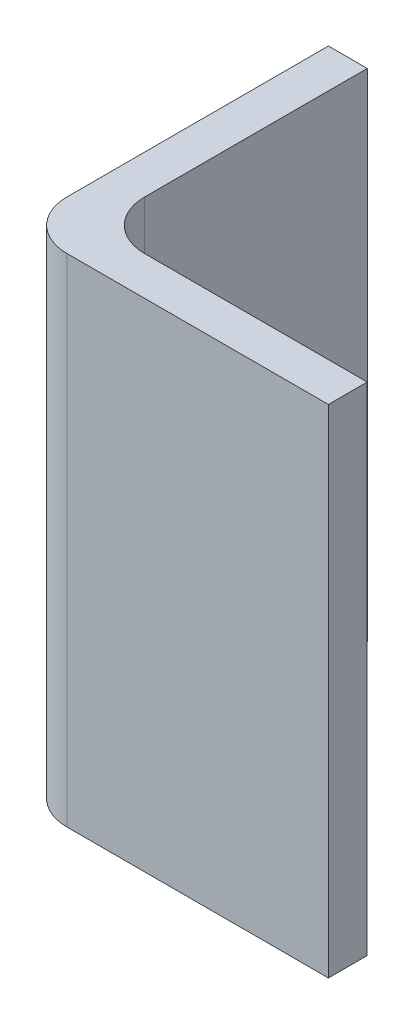
ISO-10303-21;
HEADER;
FILE_DESCRIPTION(('STEP AP214'),'2;1');
FILE_NAME('part.step','',(''),(''),'','','');
FILE_SCHEMA(('AUTOMOTIVE_DESIGN { 1 0 10303 214 1 1 1 1 }'));
ENDSEC;
DATA;
#1=APPLICATION_CONTEXT('core data for automotive mechanical design processes');
#2=APPLICATION_PROTOCOL_DEFINITION('international standard','automotive_design',2000,#1);
#3=PRODUCT_CONTEXT('',#1,'mechanical');
#4=PRODUCT('Part','Part','',(#3));
#5=PRODUCT_RELATED_PRODUCT_CATEGORY('part','',(#4));
#6=PRODUCT_DEFINITION_FORMATION('','',#4);
#7=PRODUCT_DEFINITION_CONTEXT('part definition',#1,'design');
#8=PRODUCT_DEFINITION('design','',#6,#7);
#9=PRODUCT_DEFINITION_SHAPE('','',#8);
#10=(LENGTH_UNIT() NAMED_UNIT(*) SI_UNIT(.MILLI.,.METRE.));
#11=(NAMED_UNIT(*) PLANE_ANGLE_UNIT() SI_UNIT($,.RADIAN.));
#12=(NAMED_UNIT(*) SI_UNIT($,.STERADIAN.) SOLID_ANGLE_UNIT());
#13=UNCERTAINTY_MEASURE_WITH_UNIT(LENGTH_MEASURE(1.E-05),#10,'distance_accuracy_value','');
#14=(GEOMETRIC_REPRESENTATION_CONTEXT(3) GLOBAL_UNCERTAINTY_ASSIGNED_CONTEXT((#13)) GLOBAL_UNIT_ASSIGNED_CONTEXT((#10,
#11,#12)) REPRESENTATION_CONTEXT('',''));
#15=CARTESIAN_POINT('',(0.,0.,0.));
#16=DIRECTION('',(0.,0.,1.));
#17=DIRECTION('',(1.,0.,0.));
#18=AXIS2_PLACEMENT_3D('',#15,#16,#17);
#19=CARTESIAN_POINT('',(-7.9433301054421,20.32,-9.79778819955743));
#20=DIRECTION('',(1.,0.,0.));
#21=DIRECTION('',(0.,0.,-1.));
#22=AXIS2_PLACEMENT_3D('',#19,#20,#21);
#23=PLANE('',#22);
#24=DIRECTION('',(0.,0.,1.));
#25=VECTOR('',#24,1.);
#26=CARTESIAN_POINT('',(-7.9433301054421,0.,-9.79778819955743));
#27=LINE('',#26,#25);
#28=CARTESIAN_POINT('',(-7.9433301054421,0.,-9.79778819955743));
#29=VERTEX_POINT('',#28);
#30=CARTESIAN_POINT('',(-7.9433301054421,0.,0.902211800442573));
#31=VERTEX_POINT('',#30);
#32=EDGE_CURVE('E132',#29,#31,#27,.T.);
#33=ORIENTED_EDGE('',*,*,#32,.T.);
#34=DIRECTION('',(0.,-1.,0.));
#35=VECTOR('',#34,1.);
#36=CARTESIAN_POINT('',(-7.9433301054421,20.32,0.902211800442573));
#37=LINE('',#36,#35);
#38=CARTESIAN_POINT('',(-7.9433301054421,20.32,0.902211800442573));
#39=VERTEX_POINT('',#38);
#40=EDGE_CURVE('E41',#31,#39,#37,.F.);
#41=ORIENTED_EDGE('',*,*,#40,.T.);
#42=DIRECTION('',(0.,0.,1.));
#43=VECTOR('',#42,1.);
#44=CARTESIAN_POINT('',(-7.9433301054421,20.32,-9.79778819955743));
#45=LINE('',#44,#43);
#46=CARTESIAN_POINT('',(-7.9433301054421,20.32,-9.79778819955743));
#47=VERTEX_POINT('',#46);
#48=EDGE_CURVE('E108',#47,#39,#45,.T.);
#49=ORIENTED_EDGE('',*,*,#48,.F.);
#50=DIRECTION('',(0.,-1.,0.));
#51=VECTOR('',#50,1.);
#52=CARTESIAN_POINT('',(-7.9433301054421,20.32,-9.79778819955743));
#53=LINE('',#52,#51);
#54=EDGE_CURVE('E131',#47,#29,#53,.T.);
#55=ORIENTED_EDGE('',*,*,#54,.T.);
#56=EDGE_LOOP('',(#33,#41,#49,#55));
#57=FACE_BOUND('',#56,.T.);
#58=ADVANCED_FACE('F33',(#57),#23,.F.);
#59=CARTESIAN_POINT('',(-6.3533301054421,20.32,2.90221180044257));
#60=DIRECTION('',(0.,0.,-1.));
#61=DIRECTION('',(-1.,0.,0.));
#62=AXIS2_PLACEMENT_3D('',#59,#60,#61);
#63=PLANE('',#62);
#64=DIRECTION('',(1.,0.,0.));
#65=VECTOR('',#64,1.);
#66=CARTESIAN_POINT('',(-7.9433301054421,20.32,2.90221180044257));
#67=LINE('',#66,#65);
#68=CARTESIAN_POINT('',(-5.9433301054421,20.32,2.90221180044257));
#69=VERTEX_POINT('',#68);
#70=CARTESIAN_POINT('',(4.7566698945579,20.32,2.90221180044257));
#71=VERTEX_POINT('',#70);
#72=EDGE_CURVE('E97',#69,#71,#67,.T.);
#73=ORIENTED_EDGE('',*,*,#72,.F.);
#74=DIRECTION('',(0.,-1.,0.));
#75=VECTOR('',#74,1.);
#76=CARTESIAN_POINT('',(-5.9433301054421,20.32,2.90221180044257));
#77=LINE('',#76,#75);
#78=CARTESIAN_POINT('',(-5.9433301054421,0.,2.90221180044257));
#79=VERTEX_POINT('',#78);
#80=EDGE_CURVE('E158',#69,#79,#77,.T.);
#81=ORIENTED_EDGE('',*,*,#80,.T.);
#82=DIRECTION('',(1.,0.,0.));
#83=VECTOR('',#82,1.);
#84=CARTESIAN_POINT('',(-6.3533301054421,0.,2.90221180044257));
#85=LINE('',#84,#83);
#86=CARTESIAN_POINT('',(4.7566698945579,0.,2.90221180044257));
#87=VERTEX_POINT('',#86);
#88=EDGE_CURVE('E113',#79,#87,#85,.T.);
#89=ORIENTED_EDGE('',*,*,#88,.T.);
#90=DIRECTION('',(0.,-1.,0.));
#91=VECTOR('',#90,1.);
#92=CARTESIAN_POINT('',(4.7566698945579,20.32,2.90221180044257));
#93=LINE('',#92,#91);
#94=EDGE_CURVE('E111',#71,#87,#93,.T.);
#95=ORIENTED_EDGE('',*,*,#94,.F.);
#96=EDGE_LOOP('',(#73,#81,#89,#95));
#97=FACE_BOUND('',#96,.T.);
#98=ADVANCED_FACE('F112',(#97),#63,.F.);
#99=CARTESIAN_POINT('',(4.7566698945579,20.32,2.90221180044257));
#100=DIRECTION('',(-1.,0.,0.));
#101=DIRECTION('',(0.,0.,1.));
#102=AXIS2_PLACEMENT_3D('',#99,#100,#101);
#103=PLANE('',#102);
#104=DIRECTION('',(0.,0.,-1.));
#105=VECTOR('',#104,1.);
#106=CARTESIAN_POINT('',(4.7566698945579,0.,2.90221180044257));
#107=LINE('',#106,#105);
#108=CARTESIAN_POINT('',(4.7566698945579,0.,1.31471180044257));
#109=VERTEX_POINT('',#108);
#110=EDGE_CURVE('E135',#87,#109,#107,.T.);
#111=ORIENTED_EDGE('',*,*,#110,.T.);
#112=DIRECTION('',(0.,-1.,0.));
#113=VECTOR('',#112,1.);
#114=CARTESIAN_POINT('',(4.7566698945579,20.32,1.31471180044257));
#115=LINE('',#114,#113);
#116=CARTESIAN_POINT('',(4.7566698945579,20.32,1.31471180044257));
#117=VERTEX_POINT('',#116);
#118=EDGE_CURVE('E117',#117,#109,#115,.T.);
#119=ORIENTED_EDGE('',*,*,#118,.F.);
#120=DIRECTION('',(0.,0.,-1.));
#121=VECTOR('',#120,1.);
#122=CARTESIAN_POINT('',(4.7566698945579,20.32,2.90221180044257));
#123=LINE('',#122,#121);
#124=EDGE_CURVE('E102',#71,#117,#123,.T.);
#125=ORIENTED_EDGE('',*,*,#124,.F.);
#126=ORIENTED_EDGE('',*,*,#94,.T.);
#127=EDGE_LOOP('',(#111,#119,#125,#126));
#128=FACE_BOUND('',#127,.T.);
#129=ADVANCED_FACE('F119',(#128),#103,.F.);
#130=CARTESIAN_POINT('',(-6.3533301054421,20.32,1.31471180044257));
#131=DIRECTION('',(0.,0.,1.));
#132=DIRECTION('',(1.,0.,0.));
#133=AXIS2_PLACEMENT_3D('',#130,#131,#132);
#134=PLANE('',#133);
#135=DIRECTION('',(-1.,0.,0.));
#136=VECTOR('',#135,1.);
#137=CARTESIAN_POINT('',(-6.3533301054421,0.,1.31471180044257));
#138=LINE('',#137,#136);
#139=CARTESIAN_POINT('',(-4.3533301054421,0.,1.31471180044257));
#140=VERTEX_POINT('',#139);
#141=EDGE_CURVE('E137',#109,#140,#138,.T.);
#142=ORIENTED_EDGE('',*,*,#141,.T.);
#143=DIRECTION('',(0.,-1.,0.));
#144=VECTOR('',#143,1.);
#145=CARTESIAN_POINT('',(-4.3533301054421,20.32,1.31471180044257));
#146=LINE('',#145,#144);
#147=CARTESIAN_POINT('',(-4.3533301054421,20.32,1.31471180044257));
#148=VERTEX_POINT('',#147);
#149=EDGE_CURVE('E152',#140,#148,#146,.F.);
#150=ORIENTED_EDGE('',*,*,#149,.T.);
#151=DIRECTION('',(-1.,0.,0.));
#152=VECTOR('',#151,1.);
#153=CARTESIAN_POINT('',(-6.3533301054421,20.32,1.31471180044257));
#154=LINE('',#153,#152);
#155=EDGE_CURVE('E122',#117,#148,#154,.T.);
#156=ORIENTED_EDGE('',*,*,#155,.F.);
#157=ORIENTED_EDGE('',*,*,#118,.T.);
#158=EDGE_LOOP('',(#142,#150,#156,#157));
#159=FACE_BOUND('',#158,.T.);
#160=ADVANCED_FACE('F164',(#159),#134,.F.);
#161=CARTESIAN_POINT('',(-6.3533301054421,20.32,-9.79778819955743));
#162=DIRECTION('',(-1.,0.,0.));
#163=DIRECTION('',(0.,0.,1.));
#164=AXIS2_PLACEMENT_3D('',#161,#162,#163);
#165=PLANE('',#164);
#166=DIRECTION('',(0.,0.,-1.));
#167=VECTOR('',#166,1.);
#168=CARTESIAN_POINT('',(-6.3533301054421,20.32,-9.79778819955743));
#169=LINE('',#168,#167);
#170=CARTESIAN_POINT('',(-6.3533301054421,20.32,-0.685288199557427));
#171=VERTEX_POINT('',#170);
#172=CARTESIAN_POINT('',(-6.3533301054421,20.32,-9.79778819955743));
#173=VERTEX_POINT('',#172);
#174=EDGE_CURVE('E124',#171,#173,#169,.T.);
#175=ORIENTED_EDGE('',*,*,#174,.F.);
#176=DIRECTION('',(0.,-1.,0.));
#177=VECTOR('',#176,1.);
#178=CARTESIAN_POINT('',(-6.3533301054421,0.,-0.685288199557427));
#179=LINE('',#178,#177);
#180=CARTESIAN_POINT('',(-6.3533301054421,0.,-0.685288199557427));
#181=VERTEX_POINT('',#180);
#182=EDGE_CURVE('E116',#171,#181,#179,.T.);
#183=ORIENTED_EDGE('',*,*,#182,.T.);
#184=DIRECTION('',(0.,0.,-1.));
#185=VECTOR('',#184,1.);
#186=CARTESIAN_POINT('',(-6.3533301054421,0.,-9.79778819955743));
#187=LINE('',#186,#185);
#188=CARTESIAN_POINT('',(-6.3533301054421,0.,-9.79778819955743));
#189=VERTEX_POINT('',#188);
#190=EDGE_CURVE('E140',#181,#189,#187,.T.);
#191=ORIENTED_EDGE('',*,*,#190,.T.);
#192=DIRECTION('',(0.,-1.,0.));
#193=VECTOR('',#192,1.);
#194=CARTESIAN_POINT('',(-6.3533301054421,20.32,-9.79778819955743));
#195=LINE('',#194,#193);
#196=EDGE_CURVE('E146',#173,#189,#195,.T.);
#197=ORIENTED_EDGE('',*,*,#196,.F.);
#198=EDGE_LOOP('',(#175,#183,#191,#197));
#199=FACE_BOUND('',#198,.T.);
#200=ADVANCED_FACE('F173',(#199),#165,.F.);
#201=CARTESIAN_POINT('',(-7.9433301054421,20.32,-9.79778819955743));
#202=DIRECTION('',(0.,0.,1.));
#203=DIRECTION('',(1.,0.,0.));
#204=AXIS2_PLACEMENT_3D('',#201,#202,#203);
#205=PLANE('',#204);
#206=DIRECTION('',(-1.,0.,0.));
#207=VECTOR('',#206,1.);
#208=CARTESIAN_POINT('',(-7.9433301054421,0.,-9.79778819955743));
#209=LINE('',#208,#207);
#210=EDGE_CURVE('E142',#189,#29,#209,.T.);
#211=ORIENTED_EDGE('',*,*,#210,.T.);
#212=ORIENTED_EDGE('',*,*,#54,.F.);
#213=DIRECTION('',(-1.,0.,0.));
#214=VECTOR('',#213,1.);
#215=CARTESIAN_POINT('',(-7.9433301054421,20.32,-9.79778819955743));
#216=LINE('',#215,#214);
#217=EDGE_CURVE('E129',#173,#47,#216,.T.);
#218=ORIENTED_EDGE('',*,*,#217,.F.);
#219=ORIENTED_EDGE('',*,*,#196,.T.);
#220=EDGE_LOOP('',(#211,#212,#218,#219));
#221=FACE_BOUND('',#220,.T.);
#222=ADVANCED_FACE('F178',(#221),#205,.F.);
#223=CARTESIAN_POINT('',(0.,20.32,0.));
#224=DIRECTION('',(0.,1.,0.));
#225=DIRECTION('',(0.,0.,1.));
#226=AXIS2_PLACEMENT_3D('',#223,#224,#225);
#227=PLANE('',#226);
#228=ORIENTED_EDGE('',*,*,#48,.T.);
#229=CARTESIAN_POINT('',(-5.9433301054421,20.32,0.902211800442573));
#230=DIRECTION('',(0.,1.,0.));
#231=DIRECTION('',(0.,0.,1.));
#232=AXIS2_PLACEMENT_3D('',#229,#230,#231);
#233=CIRCLE('',#232,2.);
#234=EDGE_CURVE('E11',#39,#69,#233,.T.);
#235=ORIENTED_EDGE('',*,*,#234,.T.);
#236=ORIENTED_EDGE('',*,*,#72,.T.);
#237=ORIENTED_EDGE('',*,*,#124,.T.);
#238=ORIENTED_EDGE('',*,*,#155,.T.);
#239=CARTESIAN_POINT('',(-4.3533301054421,20.32,-0.685288199557427));
#240=DIRECTION('',(0.,1.,0.));
#241=DIRECTION('',(0.,0.,1.));
#242=AXIS2_PLACEMENT_3D('',#239,#240,#241);
#243=CIRCLE('',#242,2.);
#244=EDGE_CURVE('E156',#148,#171,#243,.F.);
#245=ORIENTED_EDGE('',*,*,#244,.T.);
#246=ORIENTED_EDGE('',*,*,#174,.T.);
#247=ORIENTED_EDGE('',*,*,#217,.T.);
#248=EDGE_LOOP('',(#228,#235,#236,#237,#238,#245,#246,#247));
#249=FACE_BOUND('',#248,.T.);
#250=ADVANCED_FACE('F99',(#249),#227,.T.);
#251=CARTESIAN_POINT('',(0.,0.,0.));
#252=DIRECTION('',(0.,1.,0.));
#253=DIRECTION('',(0.,0.,1.));
#254=AXIS2_PLACEMENT_3D('',#251,#252,#253);
#255=PLANE('',#254);
#256=ORIENTED_EDGE('',*,*,#88,.F.);
#257=CARTESIAN_POINT('',(-5.9433301054421,0.,0.902211800442573));
#258=DIRECTION('',(0.,1.,0.));
#259=DIRECTION('',(0.,0.,1.));
#260=AXIS2_PLACEMENT_3D('',#257,#258,#259);
#261=CIRCLE('',#260,2.);
#262=EDGE_CURVE('E55',#79,#31,#261,.F.);
#263=ORIENTED_EDGE('',*,*,#262,.T.);
#264=ORIENTED_EDGE('',*,*,#32,.F.);
#265=ORIENTED_EDGE('',*,*,#210,.F.);
#266=ORIENTED_EDGE('',*,*,#190,.F.);
#267=CARTESIAN_POINT('',(-4.3533301054421,0.,-0.685288199557427));
#268=DIRECTION('',(0.,1.,0.));
#269=DIRECTION('',(0.,0.,1.));
#270=AXIS2_PLACEMENT_3D('',#267,#268,#269);
#271=CIRCLE('',#270,2.);
#272=EDGE_CURVE('E154',#181,#140,#271,.T.);
#273=ORIENTED_EDGE('',*,*,#272,.T.);
#274=ORIENTED_EDGE('',*,*,#141,.F.);
#275=ORIENTED_EDGE('',*,*,#110,.F.);
#276=EDGE_LOOP('',(#256,#263,#264,#265,#266,#273,#274,#275));
#277=FACE_BOUND('',#276,.T.);
#278=ADVANCED_FACE('F161',(#277),#255,.F.);
#279=CARTESIAN_POINT('',(-4.3533301054421,20.32,-0.685288199557427));
#280=DIRECTION('',(0.,1.,0.));
#281=DIRECTION('',(0.,0.,1.));
#282=AXIS2_PLACEMENT_3D('',#279,#280,#281);
#283=CYLINDRICAL_SURFACE('',#282,2.);
#284=ORIENTED_EDGE('',*,*,#244,.F.);
#285=ORIENTED_EDGE('',*,*,#149,.F.);
#286=ORIENTED_EDGE('',*,*,#272,.F.);
#287=ORIENTED_EDGE('',*,*,#182,.F.);
#288=EDGE_LOOP('',(#284,#285,#286,#287));
#289=FACE_BOUND('',#288,.T.);
#290=ADVANCED_FACE('F170',(#289),#283,.F.);
#291=CARTESIAN_POINT('',(-5.9433301054421,20.32,0.902211800442573));
#292=DIRECTION('',(0.,-1.,0.));
#293=DIRECTION('',(0.,0.,-1.));
#294=AXIS2_PLACEMENT_3D('',#291,#292,#293);
#295=CYLINDRICAL_SURFACE('',#294,2.);
#296=ORIENTED_EDGE('',*,*,#234,.F.);
#297=ORIENTED_EDGE('',*,*,#40,.F.);
#298=ORIENTED_EDGE('',*,*,#262,.F.);
#299=ORIENTED_EDGE('',*,*,#80,.F.);
#300=EDGE_LOOP('',(#296,#297,#298,#299));
#301=FACE_BOUND('',#300,.T.);
#302=ADVANCED_FACE('F35',(#301),#295,.T.);
#303=CLOSED_SHELL('',(#58,#98,#129,#160,#200,#222,#250,#278,#290,#302));
#304=MANIFOLD_SOLID_BREP('B2',#303);
#305=ADVANCED_BREP_SHAPE_REPRESENTATION('',(#18,#304),#14);
#306=SHAPE_DEFINITION_REPRESENTATION(#9,#305);
ENDSEC;
END-ISO-10303-21;
